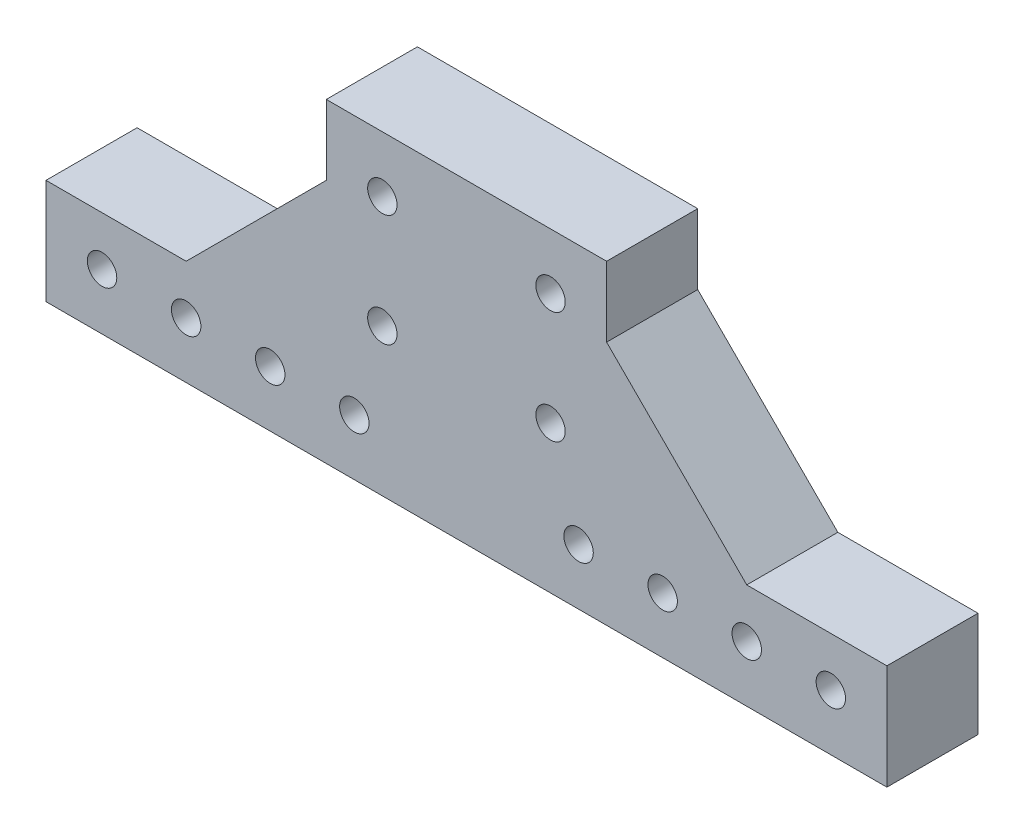
ISO-10303-21;
HEADER;
FILE_DESCRIPTION(('STEP AP214'),'2;1');
FILE_NAME('part.step','',(''),(''),'','','');
FILE_SCHEMA(('AUTOMOTIVE_DESIGN { 1 0 10303 214 1 1 1 1 }'));
ENDSEC;
DATA;
#1=APPLICATION_CONTEXT('core data for automotive mechanical design processes');
#2=APPLICATION_PROTOCOL_DEFINITION('international standard','automotive_design',2000,#1);
#3=PRODUCT_CONTEXT('',#1,'mechanical');
#4=PRODUCT('Part','Part','',(#3));
#5=PRODUCT_RELATED_PRODUCT_CATEGORY('part','',(#4));
#6=PRODUCT_DEFINITION_FORMATION('','',#4);
#7=PRODUCT_DEFINITION_CONTEXT('part definition',#1,'design');
#8=PRODUCT_DEFINITION('design','',#6,#7);
#9=PRODUCT_DEFINITION_SHAPE('','',#8);
#10=(LENGTH_UNIT() NAMED_UNIT(*) SI_UNIT(.MILLI.,.METRE.));
#11=(NAMED_UNIT(*) PLANE_ANGLE_UNIT() SI_UNIT($,.RADIAN.));
#12=(NAMED_UNIT(*) SI_UNIT($,.STERADIAN.) SOLID_ANGLE_UNIT());
#13=UNCERTAINTY_MEASURE_WITH_UNIT(LENGTH_MEASURE(1.E-05),#10,'distance_accuracy_value','');
#14=(GEOMETRIC_REPRESENTATION_CONTEXT(3) GLOBAL_UNCERTAINTY_ASSIGNED_CONTEXT((#13)) GLOBAL_UNIT_ASSIGNED_CONTEXT((#10,
#11,#12)) REPRESENTATION_CONTEXT('',''));
#15=CARTESIAN_POINT('',(0.,0.,0.));
#16=DIRECTION('',(0.,0.,1.));
#17=DIRECTION('',(1.,0.,0.));
#18=AXIS2_PLACEMENT_3D('',#15,#16,#17);
#19=CARTESIAN_POINT('',(0.,15.,13.));
#20=DIRECTION('',(1.,0.,0.));
#21=DIRECTION('',(0.,1.,0.));
#22=AXIS2_PLACEMENT_3D('',#19,#20,#21);
#23=PLANE('',#22);
#24=DIRECTION('',(0.,-1.,0.));
#25=VECTOR('',#24,1.);
#26=CARTESIAN_POINT('',(0.,15.,0.));
#27=LINE('',#26,#25);
#28=CARTESIAN_POINT('',(0.,15.,0.));
#29=VERTEX_POINT('',#28);
#30=CARTESIAN_POINT('',(0.,0.,0.));
#31=VERTEX_POINT('',#30);
#32=EDGE_CURVE('E143',#29,#31,#27,.T.);
#33=ORIENTED_EDGE('',*,*,#32,.T.);
#34=DIRECTION('',(0.,0.,-1.));
#35=VECTOR('',#34,1.);
#36=CARTESIAN_POINT('',(0.,0.,13.));
#37=LINE('',#36,#35);
#38=CARTESIAN_POINT('',(0.,0.,13.));
#39=VERTEX_POINT('',#38);
#40=EDGE_CURVE('E11',#39,#31,#37,.T.);
#41=ORIENTED_EDGE('',*,*,#40,.F.);
#42=DIRECTION('',(0.,-1.,0.));
#43=VECTOR('',#42,1.);
#44=CARTESIAN_POINT('',(0.,15.,13.));
#45=LINE('',#44,#43);
#46=CARTESIAN_POINT('',(0.,15.,13.));
#47=VERTEX_POINT('',#46);
#48=EDGE_CURVE('E162',#47,#39,#45,.T.);
#49=ORIENTED_EDGE('',*,*,#48,.F.);
#50=DIRECTION('',(0.,0.,-1.));
#51=VECTOR('',#50,1.);
#52=CARTESIAN_POINT('',(0.,15.,13.));
#53=LINE('',#52,#51);
#54=EDGE_CURVE('E139',#47,#29,#53,.T.);
#55=ORIENTED_EDGE('',*,*,#54,.T.);
#56=EDGE_LOOP('',(#33,#41,#49,#55));
#57=FACE_BOUND('',#56,.T.);
#58=ADVANCED_FACE('F35',(#57),#23,.F.);
#59=CARTESIAN_POINT('',(0.,0.,13.));
#60=DIRECTION('',(0.,1.,0.));
#61=DIRECTION('',(0.,0.,1.));
#62=AXIS2_PLACEMENT_3D('',#59,#60,#61);
#63=PLANE('',#62);
#64=DIRECTION('',(1.,0.,0.));
#65=VECTOR('',#64,1.);
#66=CARTESIAN_POINT('',(0.,0.,0.));
#67=LINE('',#66,#65);
#68=CARTESIAN_POINT('',(120.,0.,0.));
#69=VERTEX_POINT('',#68);
#70=EDGE_CURVE('E146',#31,#69,#67,.T.);
#71=ORIENTED_EDGE('',*,*,#70,.T.);
#72=DIRECTION('',(0.,0.,-1.));
#73=VECTOR('',#72,1.);
#74=CARTESIAN_POINT('',(120.,0.,13.));
#75=LINE('',#74,#73);
#76=CARTESIAN_POINT('',(120.,0.,13.));
#77=VERTEX_POINT('',#76);
#78=EDGE_CURVE('E43',#77,#69,#75,.T.);
#79=ORIENTED_EDGE('',*,*,#78,.F.);
#80=DIRECTION('',(1.,0.,0.));
#81=VECTOR('',#80,1.);
#82=CARTESIAN_POINT('',(0.,0.,13.));
#83=LINE('',#82,#81);
#84=EDGE_CURVE('E100',#39,#77,#83,.T.);
#85=ORIENTED_EDGE('',*,*,#84,.F.);
#86=ORIENTED_EDGE('',*,*,#40,.T.);
#87=EDGE_LOOP('',(#71,#79,#85,#86));
#88=FACE_BOUND('',#87,.T.);
#89=ADVANCED_FACE('F331',(#88),#63,.F.);
#90=CARTESIAN_POINT('',(120.,0.,13.));
#91=DIRECTION('',(-1.,0.,0.));
#92=DIRECTION('',(0.,0.,1.));
#93=AXIS2_PLACEMENT_3D('',#90,#91,#92);
#94=PLANE('',#93);
#95=DIRECTION('',(0.,1.,0.));
#96=VECTOR('',#95,1.);
#97=CARTESIAN_POINT('',(120.,0.,0.));
#98=LINE('',#97,#96);
#99=CARTESIAN_POINT('',(120.,15.,0.));
#100=VERTEX_POINT('',#99);
#101=EDGE_CURVE('E149',#69,#100,#98,.T.);
#102=ORIENTED_EDGE('',*,*,#101,.T.);
#103=DIRECTION('',(0.,0.,-1.));
#104=VECTOR('',#103,1.);
#105=CARTESIAN_POINT('',(120.,15.,13.));
#106=LINE('',#105,#104);
#107=CARTESIAN_POINT('',(120.,15.,13.));
#108=VERTEX_POINT('',#107);
#109=EDGE_CURVE('E175',#108,#100,#106,.T.);
#110=ORIENTED_EDGE('',*,*,#109,.F.);
#111=DIRECTION('',(0.,1.,0.));
#112=VECTOR('',#111,1.);
#113=CARTESIAN_POINT('',(120.,0.,13.));
#114=LINE('',#113,#112);
#115=EDGE_CURVE('E183',#77,#108,#114,.T.);
#116=ORIENTED_EDGE('',*,*,#115,.F.);
#117=ORIENTED_EDGE('',*,*,#78,.T.);
#118=EDGE_LOOP('',(#102,#110,#116,#117));
#119=FACE_BOUND('',#118,.T.);
#120=ADVANCED_FACE('F181',(#119),#94,.F.);
#121=CARTESIAN_POINT('',(120.,15.,13.));
#122=DIRECTION('',(0.,-1.,0.));
#123=DIRECTION('',(1.,0.,0.));
#124=AXIS2_PLACEMENT_3D('',#121,#122,#123);
#125=PLANE('',#124);
#126=DIRECTION('',(-1.,0.,0.));
#127=VECTOR('',#126,1.);
#128=CARTESIAN_POINT('',(120.,15.,0.));
#129=LINE('',#128,#127);
#130=CARTESIAN_POINT('',(100.,15.,0.));
#131=VERTEX_POINT('',#130);
#132=EDGE_CURVE('E151',#100,#131,#129,.T.);
#133=ORIENTED_EDGE('',*,*,#132,.T.);
#134=DIRECTION('',(0.,0.,-1.));
#135=VECTOR('',#134,1.);
#136=CARTESIAN_POINT('',(100.,15.,13.));
#137=LINE('',#136,#135);
#138=CARTESIAN_POINT('',(100.,15.,13.));
#139=VERTEX_POINT('',#138);
#140=EDGE_CURVE('E172',#139,#131,#137,.T.);
#141=ORIENTED_EDGE('',*,*,#140,.F.);
#142=DIRECTION('',(-1.,0.,0.));
#143=VECTOR('',#142,1.);
#144=CARTESIAN_POINT('',(120.,15.,13.));
#145=LINE('',#144,#143);
#146=EDGE_CURVE('E201',#108,#139,#145,.T.);
#147=ORIENTED_EDGE('',*,*,#146,.F.);
#148=ORIENTED_EDGE('',*,*,#109,.T.);
#149=EDGE_LOOP('',(#133,#141,#147,#148));
#150=FACE_BOUND('',#149,.T.);
#151=ADVANCED_FACE('F192',(#150),#125,.F.);
#152=CARTESIAN_POINT('',(100.,15.,13.));
#153=DIRECTION('',(-0.707106781186549,-0.707106781186546,0.));
#154=DIRECTION('',(0.707106781186546,-0.707106781186549,0.));
#155=AXIS2_PLACEMENT_3D('',#152,#153,#154);
#156=PLANE('',#155);
#157=DIRECTION('',(-0.707106781186546,0.707106781186549,0.));
#158=VECTOR('',#157,1.);
#159=CARTESIAN_POINT('',(100.,15.,0.));
#160=LINE('',#159,#158);
#161=CARTESIAN_POINT('',(80.0000000000001,35.0000000000001,0.));
#162=VERTEX_POINT('',#161);
#163=EDGE_CURVE('E153',#131,#162,#160,.T.);
#164=ORIENTED_EDGE('',*,*,#163,.T.);
#165=DIRECTION('',(0.,0.,-1.));
#166=VECTOR('',#165,1.);
#167=CARTESIAN_POINT('',(80.0000000000001,35.0000000000001,13.));
#168=LINE('',#167,#166);
#169=CARTESIAN_POINT('',(80.0000000000001,35.0000000000001,13.));
#170=VERTEX_POINT('',#169);
#171=EDGE_CURVE('E169',#170,#162,#168,.T.);
#172=ORIENTED_EDGE('',*,*,#171,.F.);
#173=DIRECTION('',(-0.707106781186546,0.707106781186549,0.));
#174=VECTOR('',#173,1.);
#175=CARTESIAN_POINT('',(100.,15.,13.));
#176=LINE('',#175,#174);
#177=EDGE_CURVE('E198',#139,#170,#176,.T.);
#178=ORIENTED_EDGE('',*,*,#177,.F.);
#179=ORIENTED_EDGE('',*,*,#140,.T.);
#180=EDGE_LOOP('',(#164,#172,#178,#179));
#181=FACE_BOUND('',#180,.T.);
#182=ADVANCED_FACE('F196',(#181),#156,.F.);
#183=CARTESIAN_POINT('',(80.0000000000001,35.0000000000001,13.));
#184=DIRECTION('',(-1.,0.,0.));
#185=DIRECTION('',(0.,-1.,0.));
#186=AXIS2_PLACEMENT_3D('',#183,#184,#185);
#187=PLANE('',#186);
#188=DIRECTION('',(0.,1.,0.));
#189=VECTOR('',#188,1.);
#190=CARTESIAN_POINT('',(80.0000000000001,35.0000000000001,0.));
#191=LINE('',#190,#189);
#192=CARTESIAN_POINT('',(80.0000000000001,45.,0.));
#193=VERTEX_POINT('',#192);
#194=EDGE_CURVE('E155',#162,#193,#191,.T.);
#195=ORIENTED_EDGE('',*,*,#194,.T.);
#196=DIRECTION('',(0.,0.,-1.));
#197=VECTOR('',#196,1.);
#198=CARTESIAN_POINT('',(80.0000000000001,45.,13.));
#199=LINE('',#198,#197);
#200=CARTESIAN_POINT('',(80.0000000000001,45.,13.));
#201=VERTEX_POINT('',#200);
#202=EDGE_CURVE('E166',#201,#193,#199,.T.);
#203=ORIENTED_EDGE('',*,*,#202,.F.);
#204=DIRECTION('',(0.,1.,0.));
#205=VECTOR('',#204,1.);
#206=CARTESIAN_POINT('',(80.0000000000001,35.0000000000001,13.));
#207=LINE('',#206,#205);
#208=EDGE_CURVE('E200',#170,#201,#207,.T.);
#209=ORIENTED_EDGE('',*,*,#208,.F.);
#210=ORIENTED_EDGE('',*,*,#171,.T.);
#211=EDGE_LOOP('',(#195,#203,#209,#210));
#212=FACE_BOUND('',#211,.T.);
#213=ADVANCED_FACE('F343',(#212),#187,.F.);
#214=CARTESIAN_POINT('',(80.0000000000001,45.,13.));
#215=DIRECTION('',(0.,-1.,0.));
#216=DIRECTION('',(1.,0.,0.));
#217=AXIS2_PLACEMENT_3D('',#214,#215,#216);
#218=PLANE('',#217);
#219=DIRECTION('',(-1.,0.,0.));
#220=VECTOR('',#219,1.);
#221=CARTESIAN_POINT('',(80.0000000000001,45.,0.));
#222=LINE('',#221,#220);
#223=CARTESIAN_POINT('',(40.0000000000001,45.,0.));
#224=VERTEX_POINT('',#223);
#225=EDGE_CURVE('E157',#193,#224,#222,.T.);
#226=ORIENTED_EDGE('',*,*,#225,.T.);
#227=DIRECTION('',(0.,0.,-1.));
#228=VECTOR('',#227,1.);
#229=CARTESIAN_POINT('',(40.0000000000001,45.,13.));
#230=LINE('',#229,#228);
#231=CARTESIAN_POINT('',(40.0000000000001,45.,13.));
#232=VERTEX_POINT('',#231);
#233=EDGE_CURVE('E134',#232,#224,#230,.T.);
#234=ORIENTED_EDGE('',*,*,#233,.F.);
#235=DIRECTION('',(-1.,0.,0.));
#236=VECTOR('',#235,1.);
#237=CARTESIAN_POINT('',(80.0000000000001,45.,13.));
#238=LINE('',#237,#236);
#239=EDGE_CURVE('E125',#201,#232,#238,.T.);
#240=ORIENTED_EDGE('',*,*,#239,.F.);
#241=ORIENTED_EDGE('',*,*,#202,.T.);
#242=EDGE_LOOP('',(#226,#234,#240,#241));
#243=FACE_BOUND('',#242,.T.);
#244=ADVANCED_FACE('F340',(#243),#218,.F.);
#245=CARTESIAN_POINT('',(40.0000000000001,45.,13.));
#246=DIRECTION('',(1.,0.,0.));
#247=DIRECTION('',(0.,1.,0.));
#248=AXIS2_PLACEMENT_3D('',#245,#246,#247);
#249=PLANE('',#248);
#250=DIRECTION('',(0.,-1.,0.));
#251=VECTOR('',#250,1.);
#252=CARTESIAN_POINT('',(40.0000000000001,45.,0.));
#253=LINE('',#252,#251);
#254=CARTESIAN_POINT('',(40.,35.0000000000001,0.));
#255=VERTEX_POINT('',#254);
#256=EDGE_CURVE('E133',#224,#255,#253,.T.);
#257=ORIENTED_EDGE('',*,*,#256,.T.);
#258=DIRECTION('',(0.,0.,-1.));
#259=VECTOR('',#258,1.);
#260=CARTESIAN_POINT('',(40.,35.0000000000001,13.));
#261=LINE('',#260,#259);
#262=CARTESIAN_POINT('',(40.,35.0000000000001,13.));
#263=VERTEX_POINT('',#262);
#264=EDGE_CURVE('E130',#263,#255,#261,.T.);
#265=ORIENTED_EDGE('',*,*,#264,.F.);
#266=DIRECTION('',(0.,-1.,0.));
#267=VECTOR('',#266,1.);
#268=CARTESIAN_POINT('',(40.0000000000001,45.,13.));
#269=LINE('',#268,#267);
#270=EDGE_CURVE('E119',#232,#263,#269,.T.);
#271=ORIENTED_EDGE('',*,*,#270,.F.);
#272=ORIENTED_EDGE('',*,*,#233,.T.);
#273=EDGE_LOOP('',(#257,#265,#271,#272));
#274=FACE_BOUND('',#273,.T.);
#275=ADVANCED_FACE('F131',(#274),#249,.F.);
#276=CARTESIAN_POINT('',(40.,35.0000000000001,13.));
#277=DIRECTION('',(0.70710678118655,-0.707106781186545,0.));
#278=DIRECTION('',(0.707106781186545,0.70710678118655,0.));
#279=AXIS2_PLACEMENT_3D('',#276,#277,#278);
#280=PLANE('',#279);
#281=DIRECTION('',(-0.707106781186545,-0.70710678118655,0.));
#282=VECTOR('',#281,1.);
#283=CARTESIAN_POINT('',(40.,35.0000000000001,0.));
#284=LINE('',#283,#282);
#285=CARTESIAN_POINT('',(20.,15.,0.));
#286=VERTEX_POINT('',#285);
#287=EDGE_CURVE('E86',#255,#286,#284,.T.);
#288=ORIENTED_EDGE('',*,*,#287,.T.);
#289=DIRECTION('',(0.,0.,-1.));
#290=VECTOR('',#289,1.);
#291=CARTESIAN_POINT('',(20.,15.,13.));
#292=LINE('',#291,#290);
#293=CARTESIAN_POINT('',(20.,15.,13.));
#294=VERTEX_POINT('',#293);
#295=EDGE_CURVE('E135',#294,#286,#292,.T.);
#296=ORIENTED_EDGE('',*,*,#295,.F.);
#297=DIRECTION('',(-0.707106781186545,-0.70710678118655,0.));
#298=VECTOR('',#297,1.);
#299=CARTESIAN_POINT('',(40.,35.0000000000001,13.));
#300=LINE('',#299,#298);
#301=EDGE_CURVE('E123',#263,#294,#300,.T.);
#302=ORIENTED_EDGE('',*,*,#301,.F.);
#303=ORIENTED_EDGE('',*,*,#264,.T.);
#304=EDGE_LOOP('',(#288,#296,#302,#303));
#305=FACE_BOUND('',#304,.T.);
#306=ADVANCED_FACE('F137',(#305),#280,.F.);
#307=CARTESIAN_POINT('',(20.,15.,13.));
#308=DIRECTION('',(0.,-1.,0.));
#309=DIRECTION('',(1.,0.,0.));
#310=AXIS2_PLACEMENT_3D('',#307,#308,#309);
#311=PLANE('',#310);
#312=DIRECTION('',(-1.,0.,0.));
#313=VECTOR('',#312,1.);
#314=CARTESIAN_POINT('',(20.,15.,0.));
#315=LINE('',#314,#313);
#316=EDGE_CURVE('E92',#286,#29,#315,.T.);
#317=ORIENTED_EDGE('',*,*,#316,.T.);
#318=ORIENTED_EDGE('',*,*,#54,.F.);
#319=DIRECTION('',(-1.,0.,0.));
#320=VECTOR('',#319,1.);
#321=CARTESIAN_POINT('',(20.,15.,13.));
#322=LINE('',#321,#320);
#323=EDGE_CURVE('E51',#294,#47,#322,.T.);
#324=ORIENTED_EDGE('',*,*,#323,.F.);
#325=ORIENTED_EDGE('',*,*,#295,.T.);
#326=EDGE_LOOP('',(#317,#318,#324,#325));
#327=FACE_BOUND('',#326,.T.);
#328=ADVANCED_FACE('F292',(#327),#311,.F.);
#329=CARTESIAN_POINT('',(0.,0.,13.));
#330=DIRECTION('',(0.,0.,1.));
#331=DIRECTION('',(1.,0.,0.));
#332=AXIS2_PLACEMENT_3D('',#329,#330,#331);
#333=PLANE('',#332);
#334=CARTESIAN_POINT('',(32.,8.,13.));
#335=DIRECTION('',(0.,0.,1.));
#336=DIRECTION('',(1.,0.,0.));
#337=AXIS2_PLACEMENT_3D('',#334,#335,#336);
#338=CIRCLE('',#337,2.1);
#339=CARTESIAN_POINT('',(34.1,8.,13.));
#340=VERTEX_POINT('',#339);
#341=EDGE_CURVE('E275',#340,#340,#338,.T.);
#342=ORIENTED_EDGE('',*,*,#341,.F.);
#343=EDGE_LOOP('',(#342));
#344=FACE_BOUND('',#343,.T.);
#345=CARTESIAN_POINT('',(44.,8.,13.));
#346=DIRECTION('',(0.,0.,1.));
#347=DIRECTION('',(1.,0.,0.));
#348=AXIS2_PLACEMENT_3D('',#345,#346,#347);
#349=CIRCLE('',#348,2.1);
#350=CARTESIAN_POINT('',(46.1,8.,13.));
#351=VERTEX_POINT('',#350);
#352=EDGE_CURVE('E269',#351,#351,#349,.T.);
#353=ORIENTED_EDGE('',*,*,#352,.F.);
#354=EDGE_LOOP('',(#353));
#355=FACE_BOUND('',#354,.T.);
#356=CARTESIAN_POINT('',(76.0000000000001,8.,13.));
#357=DIRECTION('',(0.,0.,1.));
#358=DIRECTION('',(1.,0.,0.));
#359=AXIS2_PLACEMENT_3D('',#356,#357,#358);
#360=CIRCLE('',#359,2.1);
#361=CARTESIAN_POINT('',(78.1000000000001,8.,13.));
#362=VERTEX_POINT('',#361);
#363=EDGE_CURVE('E263',#362,#362,#360,.T.);
#364=ORIENTED_EDGE('',*,*,#363,.F.);
#365=EDGE_LOOP('',(#364));
#366=FACE_BOUND('',#365,.T.);
#367=CARTESIAN_POINT('',(88.0000000000001,8.,13.));
#368=DIRECTION('',(0.,0.,1.));
#369=DIRECTION('',(1.,0.,0.));
#370=AXIS2_PLACEMENT_3D('',#367,#368,#369);
#371=CIRCLE('',#370,2.1);
#372=CARTESIAN_POINT('',(90.1000000000001,8.,13.));
#373=VERTEX_POINT('',#372);
#374=EDGE_CURVE('E257',#373,#373,#371,.T.);
#375=ORIENTED_EDGE('',*,*,#374,.F.);
#376=EDGE_LOOP('',(#375));
#377=FACE_BOUND('',#376,.T.);
#378=CARTESIAN_POINT('',(8.,8.,13.));
#379=DIRECTION('',(0.,0.,1.));
#380=DIRECTION('',(1.,0.,0.));
#381=AXIS2_PLACEMENT_3D('',#378,#379,#380);
#382=CIRCLE('',#381,2.1);
#383=CARTESIAN_POINT('',(10.1,8.,13.));
#384=VERTEX_POINT('',#383);
#385=EDGE_CURVE('E227',#384,#384,#382,.T.);
#386=ORIENTED_EDGE('',*,*,#385,.F.);
#387=EDGE_LOOP('',(#386));
#388=FACE_BOUND('',#387,.T.);
#389=CARTESIAN_POINT('',(72.0000000000001,21.,13.));
#390=DIRECTION('',(0.,0.,1.));
#391=DIRECTION('',(1.,0.,0.));
#392=AXIS2_PLACEMENT_3D('',#389,#390,#391);
#393=CIRCLE('',#392,2.09999999999999);
#394=CARTESIAN_POINT('',(74.1000000000001,21.,13.));
#395=VERTEX_POINT('',#394);
#396=EDGE_CURVE('E234',#395,#395,#393,.T.);
#397=ORIENTED_EDGE('',*,*,#396,.F.);
#398=EDGE_LOOP('',(#397));
#399=FACE_BOUND('',#398,.T.);
#400=CARTESIAN_POINT('',(48.0000000000001,21.,13.));
#401=DIRECTION('',(0.,0.,1.));
#402=DIRECTION('',(1.,0.,0.));
#403=AXIS2_PLACEMENT_3D('',#400,#401,#402);
#404=CIRCLE('',#403,2.1);
#405=CARTESIAN_POINT('',(50.1000000000001,21.,13.));
#406=VERTEX_POINT('',#405);
#407=EDGE_CURVE('E215',#406,#406,#404,.T.);
#408=ORIENTED_EDGE('',*,*,#407,.F.);
#409=EDGE_LOOP('',(#408));
#410=FACE_BOUND('',#409,.T.);
#411=CARTESIAN_POINT('',(72.0000000000001,37.,13.));
#412=DIRECTION('',(0.,0.,1.));
#413=DIRECTION('',(1.,0.,0.));
#414=AXIS2_PLACEMENT_3D('',#411,#412,#413);
#415=CIRCLE('',#414,2.09999999999999);
#416=CARTESIAN_POINT('',(74.1000000000001,37.,13.));
#417=VERTEX_POINT('',#416);
#418=EDGE_CURVE('E222',#417,#417,#415,.T.);
#419=ORIENTED_EDGE('',*,*,#418,.F.);
#420=EDGE_LOOP('',(#419));
#421=FACE_BOUND('',#420,.T.);
#422=CARTESIAN_POINT('',(20.,8.,13.));
#423=DIRECTION('',(0.,0.,1.));
#424=DIRECTION('',(1.,0.,0.));
#425=AXIS2_PLACEMENT_3D('',#422,#423,#424);
#426=CIRCLE('',#425,2.1);
#427=CARTESIAN_POINT('',(22.1,8.,13.));
#428=VERTEX_POINT('',#427);
#429=EDGE_CURVE('E252',#428,#428,#426,.T.);
#430=ORIENTED_EDGE('',*,*,#429,.F.);
#431=EDGE_LOOP('',(#430));
#432=FACE_BOUND('',#431,.T.);
#433=CARTESIAN_POINT('',(100.,8.,13.));
#434=DIRECTION('',(0.,0.,1.));
#435=DIRECTION('',(1.,0.,0.));
#436=AXIS2_PLACEMENT_3D('',#433,#434,#435);
#437=CIRCLE('',#436,2.1);
#438=CARTESIAN_POINT('',(102.1,8.,13.));
#439=VERTEX_POINT('',#438);
#440=EDGE_CURVE('E246',#439,#439,#437,.T.);
#441=ORIENTED_EDGE('',*,*,#440,.F.);
#442=EDGE_LOOP('',(#441));
#443=FACE_BOUND('',#442,.T.);
#444=CARTESIAN_POINT('',(112.,8.,13.));
#445=DIRECTION('',(0.,0.,1.));
#446=DIRECTION('',(1.,0.,0.));
#447=AXIS2_PLACEMENT_3D('',#444,#445,#446);
#448=CIRCLE('',#447,2.1);
#449=CARTESIAN_POINT('',(114.1,8.,13.));
#450=VERTEX_POINT('',#449);
#451=EDGE_CURVE('E239',#450,#450,#448,.T.);
#452=ORIENTED_EDGE('',*,*,#451,.F.);
#453=EDGE_LOOP('',(#452));
#454=FACE_BOUND('',#453,.T.);
#455=CARTESIAN_POINT('',(48.0000000000001,37.,13.));
#456=DIRECTION('',(0.,0.,1.));
#457=DIRECTION('',(1.,0.,0.));
#458=AXIS2_PLACEMENT_3D('',#455,#456,#457);
#459=CIRCLE('',#458,2.1);
#460=CARTESIAN_POINT('',(50.1000000000001,37.,13.));
#461=VERTEX_POINT('',#460);
#462=EDGE_CURVE('E209',#461,#461,#459,.T.);
#463=ORIENTED_EDGE('',*,*,#462,.F.);
#464=EDGE_LOOP('',(#463));
#465=FACE_BOUND('',#464,.T.);
#466=ORIENTED_EDGE('',*,*,#48,.T.);
#467=ORIENTED_EDGE('',*,*,#84,.T.);
#468=ORIENTED_EDGE('',*,*,#115,.T.);
#469=ORIENTED_EDGE('',*,*,#146,.T.);
#470=ORIENTED_EDGE('',*,*,#177,.T.);
#471=ORIENTED_EDGE('',*,*,#208,.T.);
#472=ORIENTED_EDGE('',*,*,#239,.T.);
#473=ORIENTED_EDGE('',*,*,#270,.T.);
#474=ORIENTED_EDGE('',*,*,#301,.T.);
#475=ORIENTED_EDGE('',*,*,#323,.T.);
#476=EDGE_LOOP('',(#466,#467,#468,#469,#470,#471,#472,#473,#474,#475));
#477=FACE_BOUND('',#476,.T.);
#478=ADVANCED_FACE('F121',(#344,#355,#366,#377,#388,#399,#410,#421,#432,#443,#454,#465,#477),
#333,.T.);
#479=CARTESIAN_POINT('',(0.,0.,0.));
#480=DIRECTION('',(0.,0.,1.));
#481=DIRECTION('',(1.,0.,0.));
#482=AXIS2_PLACEMENT_3D('',#479,#480,#481);
#483=PLANE('',#482);
#484=CARTESIAN_POINT('',(32.,8.,0.));
#485=DIRECTION('',(0.,0.,1.));
#486=DIRECTION('',(1.,0.,0.));
#487=AXIS2_PLACEMENT_3D('',#484,#485,#486);
#488=CIRCLE('',#487,2.1);
#489=CARTESIAN_POINT('',(34.1,8.,0.));
#490=VERTEX_POINT('',#489);
#491=EDGE_CURVE('E243',#490,#490,#488,.T.);
#492=ORIENTED_EDGE('',*,*,#491,.T.);
#493=EDGE_LOOP('',(#492));
#494=FACE_BOUND('',#493,.T.);
#495=CARTESIAN_POINT('',(44.,8.,0.));
#496=DIRECTION('',(0.,0.,1.));
#497=DIRECTION('',(1.,0.,0.));
#498=AXIS2_PLACEMENT_3D('',#495,#496,#497);
#499=CIRCLE('',#498,2.1);
#500=CARTESIAN_POINT('',(46.1,8.,0.));
#501=VERTEX_POINT('',#500);
#502=EDGE_CURVE('E272',#501,#501,#499,.T.);
#503=ORIENTED_EDGE('',*,*,#502,.T.);
#504=EDGE_LOOP('',(#503));
#505=FACE_BOUND('',#504,.T.);
#506=CARTESIAN_POINT('',(76.0000000000001,8.,0.));
#507=DIRECTION('',(0.,0.,1.));
#508=DIRECTION('',(1.,0.,0.));
#509=AXIS2_PLACEMENT_3D('',#506,#507,#508);
#510=CIRCLE('',#509,2.1);
#511=CARTESIAN_POINT('',(78.1000000000001,8.,0.));
#512=VERTEX_POINT('',#511);
#513=EDGE_CURVE('E266',#512,#512,#510,.T.);
#514=ORIENTED_EDGE('',*,*,#513,.T.);
#515=EDGE_LOOP('',(#514));
#516=FACE_BOUND('',#515,.T.);
#517=CARTESIAN_POINT('',(88.0000000000001,8.,0.));
#518=DIRECTION('',(0.,0.,1.));
#519=DIRECTION('',(1.,0.,0.));
#520=AXIS2_PLACEMENT_3D('',#517,#518,#519);
#521=CIRCLE('',#520,2.1);
#522=CARTESIAN_POINT('',(90.1000000000001,8.,0.));
#523=VERTEX_POINT('',#522);
#524=EDGE_CURVE('E260',#523,#523,#521,.T.);
#525=ORIENTED_EDGE('',*,*,#524,.T.);
#526=EDGE_LOOP('',(#525));
#527=FACE_BOUND('',#526,.T.);
#528=ORIENTED_EDGE('',*,*,#32,.F.);
#529=ORIENTED_EDGE('',*,*,#316,.F.);
#530=ORIENTED_EDGE('',*,*,#287,.F.);
#531=ORIENTED_EDGE('',*,*,#256,.F.);
#532=ORIENTED_EDGE('',*,*,#225,.F.);
#533=ORIENTED_EDGE('',*,*,#194,.F.);
#534=ORIENTED_EDGE('',*,*,#163,.F.);
#535=ORIENTED_EDGE('',*,*,#132,.F.);
#536=ORIENTED_EDGE('',*,*,#101,.F.);
#537=ORIENTED_EDGE('',*,*,#70,.F.);
#538=EDGE_LOOP('',(#528,#529,#530,#531,#532,#533,#534,#535,#536,#537));
#539=FACE_BOUND('',#538,.T.);
#540=ADVANCED_FACE('F187',(#494,#505,#516,#527,#539),#483,.F.);
#541=CARTESIAN_POINT('',(48.0000000000001,37.,10.));
#542=DIRECTION('',(0.,0.,1.));
#543=DIRECTION('',(1.,0.,0.));
#544=AXIS2_PLACEMENT_3D('',#541,#542,#543);
#545=CYLINDRICAL_SURFACE('',#544,2.1);
#546=CARTESIAN_POINT('',(48.0000000000001,37.,10.));
#547=DIRECTION('',(0.,0.,1.));
#548=DIRECTION('',(1.,0.,0.));
#549=AXIS2_PLACEMENT_3D('',#546,#547,#548);
#550=CIRCLE('',#549,2.1);
#551=CARTESIAN_POINT('',(50.1000000000001,37.,10.));
#552=VERTEX_POINT('',#551);
#553=EDGE_CURVE('E147',#552,#552,#550,.T.);
#554=ORIENTED_EDGE('',*,*,#553,.F.);
#555=EDGE_LOOP('',(#554));
#556=FACE_BOUND('',#555,.T.);
#557=ORIENTED_EDGE('',*,*,#462,.T.);
#558=EDGE_LOOP('',(#557));
#559=FACE_BOUND('',#558,.T.);
#560=ADVANCED_FACE('F316',(#556,#559),#545,.F.);
#561=CARTESIAN_POINT('',(48.0000000000001,37.,10.));
#562=DIRECTION('',(0.,0.,1.));
#563=DIRECTION('',(1.,0.,0.));
#564=AXIS2_PLACEMENT_3D('',#561,#562,#563);
#565=PLANE('',#564);
#566=ORIENTED_EDGE('',*,*,#553,.T.);
#567=EDGE_LOOP('',(#566));
#568=FACE_BOUND('',#567,.T.);
#569=ADVANCED_FACE('F318',(#568),#565,.T.);
#570=CARTESIAN_POINT('',(112.,8.,10.));
#571=DIRECTION('',(0.,0.,1.));
#572=DIRECTION('',(1.,0.,0.));
#573=AXIS2_PLACEMENT_3D('',#570,#571,#572);
#574=CYLINDRICAL_SURFACE('',#573,2.1);
#575=CARTESIAN_POINT('',(112.,8.,10.));
#576=DIRECTION('',(0.,0.,1.));
#577=DIRECTION('',(1.,0.,0.));
#578=AXIS2_PLACEMENT_3D('',#575,#576,#577);
#579=CIRCLE('',#578,2.1);
#580=CARTESIAN_POINT('',(114.1,8.,10.));
#581=VERTEX_POINT('',#580);
#582=EDGE_CURVE('E242',#581,#581,#579,.T.);
#583=ORIENTED_EDGE('',*,*,#582,.F.);
#584=EDGE_LOOP('',(#583));
#585=FACE_BOUND('',#584,.T.);
#586=ORIENTED_EDGE('',*,*,#451,.T.);
#587=EDGE_LOOP('',(#586));
#588=FACE_BOUND('',#587,.T.);
#589=ADVANCED_FACE('F325',(#585,#588),#574,.F.);
#590=CARTESIAN_POINT('',(112.,8.,10.));
#591=DIRECTION('',(0.,0.,1.));
#592=DIRECTION('',(1.,0.,0.));
#593=AXIS2_PLACEMENT_3D('',#590,#591,#592);
#594=PLANE('',#593);
#595=ORIENTED_EDGE('',*,*,#582,.T.);
#596=EDGE_LOOP('',(#595));
#597=FACE_BOUND('',#596,.T.);
#598=ADVANCED_FACE('F423',(#597),#594,.T.);
#599=CARTESIAN_POINT('',(100.,8.,10.));
#600=DIRECTION('',(0.,0.,1.));
#601=DIRECTION('',(1.,0.,0.));
#602=AXIS2_PLACEMENT_3D('',#599,#600,#601);
#603=CYLINDRICAL_SURFACE('',#602,2.1);
#604=CARTESIAN_POINT('',(100.,8.,10.));
#605=DIRECTION('',(0.,0.,1.));
#606=DIRECTION('',(1.,0.,0.));
#607=AXIS2_PLACEMENT_3D('',#604,#605,#606);
#608=CIRCLE('',#607,2.1);
#609=CARTESIAN_POINT('',(102.1,8.,10.));
#610=VERTEX_POINT('',#609);
#611=EDGE_CURVE('E249',#610,#610,#608,.T.);
#612=ORIENTED_EDGE('',*,*,#611,.F.);
#613=EDGE_LOOP('',(#612));
#614=FACE_BOUND('',#613,.T.);
#615=ORIENTED_EDGE('',*,*,#440,.T.);
#616=EDGE_LOOP('',(#615));
#617=FACE_BOUND('',#616,.T.);
#618=ADVANCED_FACE('F433',(#614,#617),#603,.F.);
#619=CARTESIAN_POINT('',(100.,8.,10.));
#620=DIRECTION('',(0.,0.,1.));
#621=DIRECTION('',(1.,0.,0.));
#622=AXIS2_PLACEMENT_3D('',#619,#620,#621);
#623=PLANE('',#622);
#624=ORIENTED_EDGE('',*,*,#611,.T.);
#625=EDGE_LOOP('',(#624));
#626=FACE_BOUND('',#625,.T.);
#627=ADVANCED_FACE('F443',(#626),#623,.T.);
#628=CARTESIAN_POINT('',(20.,8.,10.));
#629=DIRECTION('',(0.,0.,1.));
#630=DIRECTION('',(1.,0.,0.));
#631=AXIS2_PLACEMENT_3D('',#628,#629,#630);
#632=CYLINDRICAL_SURFACE('',#631,2.1);
#633=CARTESIAN_POINT('',(20.,8.,10.));
#634=DIRECTION('',(0.,0.,1.));
#635=DIRECTION('',(1.,0.,0.));
#636=AXIS2_PLACEMENT_3D('',#633,#634,#635);
#637=CIRCLE('',#636,2.1);
#638=CARTESIAN_POINT('',(22.1,8.,10.));
#639=VERTEX_POINT('',#638);
#640=EDGE_CURVE('E231',#639,#639,#637,.T.);
#641=ORIENTED_EDGE('',*,*,#640,.F.);
#642=EDGE_LOOP('',(#641));
#643=FACE_BOUND('',#642,.T.);
#644=ORIENTED_EDGE('',*,*,#429,.T.);
#645=EDGE_LOOP('',(#644));
#646=FACE_BOUND('',#645,.T.);
#647=ADVANCED_FACE('F453',(#643,#646),#632,.F.);
#648=CARTESIAN_POINT('',(20.,8.,10.));
#649=DIRECTION('',(0.,0.,1.));
#650=DIRECTION('',(1.,0.,0.));
#651=AXIS2_PLACEMENT_3D('',#648,#649,#650);
#652=PLANE('',#651);
#653=ORIENTED_EDGE('',*,*,#640,.T.);
#654=EDGE_LOOP('',(#653));
#655=FACE_BOUND('',#654,.T.);
#656=ADVANCED_FACE('F463',(#655),#652,.T.);
#657=CARTESIAN_POINT('',(72.0000000000001,37.,10.));
#658=DIRECTION('',(0.,0.,1.));
#659=DIRECTION('',(1.,0.,0.));
#660=AXIS2_PLACEMENT_3D('',#657,#658,#659);
#661=CYLINDRICAL_SURFACE('',#660,2.09999999999999);
#662=CARTESIAN_POINT('',(72.0000000000001,37.,10.));
#663=DIRECTION('',(0.,0.,1.));
#664=DIRECTION('',(1.,0.,0.));
#665=AXIS2_PLACEMENT_3D('',#662,#663,#664);
#666=CIRCLE('',#665,2.09999999999999);
#667=CARTESIAN_POINT('',(74.1000000000001,37.,10.));
#668=VERTEX_POINT('',#667);
#669=EDGE_CURVE('E212',#668,#668,#666,.T.);
#670=ORIENTED_EDGE('',*,*,#669,.F.);
#671=EDGE_LOOP('',(#670));
#672=FACE_BOUND('',#671,.T.);
#673=ORIENTED_EDGE('',*,*,#418,.T.);
#674=EDGE_LOOP('',(#673));
#675=FACE_BOUND('',#674,.T.);
#676=ADVANCED_FACE('F473',(#672,#675),#661,.F.);
#677=CARTESIAN_POINT('',(72.0000000000001,37.,10.));
#678=DIRECTION('',(0.,0.,1.));
#679=DIRECTION('',(1.,0.,0.));
#680=AXIS2_PLACEMENT_3D('',#677,#678,#679);
#681=PLANE('',#680);
#682=ORIENTED_EDGE('',*,*,#669,.T.);
#683=EDGE_LOOP('',(#682));
#684=FACE_BOUND('',#683,.T.);
#685=ADVANCED_FACE('F483',(#684),#681,.T.);
#686=CARTESIAN_POINT('',(48.0000000000001,21.,10.));
#687=DIRECTION('',(0.,0.,1.));
#688=DIRECTION('',(1.,0.,0.));
#689=AXIS2_PLACEMENT_3D('',#686,#687,#688);
#690=CYLINDRICAL_SURFACE('',#689,2.1);
#691=CARTESIAN_POINT('',(48.0000000000001,21.,10.));
#692=DIRECTION('',(0.,0.,1.));
#693=DIRECTION('',(1.,0.,0.));
#694=AXIS2_PLACEMENT_3D('',#691,#692,#693);
#695=CIRCLE('',#694,2.1);
#696=CARTESIAN_POINT('',(50.1000000000001,21.,10.));
#697=VERTEX_POINT('',#696);
#698=EDGE_CURVE('E218',#697,#697,#695,.T.);
#699=ORIENTED_EDGE('',*,*,#698,.F.);
#700=EDGE_LOOP('',(#699));
#701=FACE_BOUND('',#700,.T.);
#702=ORIENTED_EDGE('',*,*,#407,.T.);
#703=EDGE_LOOP('',(#702));
#704=FACE_BOUND('',#703,.T.);
#705=ADVANCED_FACE('F493',(#701,#704),#690,.F.);
#706=CARTESIAN_POINT('',(48.0000000000001,21.,10.));
#707=DIRECTION('',(0.,0.,1.));
#708=DIRECTION('',(1.,0.,0.));
#709=AXIS2_PLACEMENT_3D('',#706,#707,#708);
#710=PLANE('',#709);
#711=ORIENTED_EDGE('',*,*,#698,.T.);
#712=EDGE_LOOP('',(#711));
#713=FACE_BOUND('',#712,.T.);
#714=ADVANCED_FACE('F503',(#713),#710,.T.);
#715=CARTESIAN_POINT('',(72.0000000000001,21.,10.));
#716=DIRECTION('',(0.,0.,1.));
#717=DIRECTION('',(1.,0.,0.));
#718=AXIS2_PLACEMENT_3D('',#715,#716,#717);
#719=CYLINDRICAL_SURFACE('',#718,2.09999999999999);
#720=CARTESIAN_POINT('',(72.0000000000001,21.,10.));
#721=DIRECTION('',(0.,0.,1.));
#722=DIRECTION('',(1.,0.,0.));
#723=AXIS2_PLACEMENT_3D('',#720,#721,#722);
#724=CIRCLE('',#723,2.09999999999999);
#725=CARTESIAN_POINT('',(74.1000000000001,21.,10.));
#726=VERTEX_POINT('',#725);
#727=EDGE_CURVE('E219',#726,#726,#724,.T.);
#728=ORIENTED_EDGE('',*,*,#727,.F.);
#729=EDGE_LOOP('',(#728));
#730=FACE_BOUND('',#729,.T.);
#731=ORIENTED_EDGE('',*,*,#396,.T.);
#732=EDGE_LOOP('',(#731));
#733=FACE_BOUND('',#732,.T.);
#734=ADVANCED_FACE('F513',(#730,#733),#719,.F.);
#735=CARTESIAN_POINT('',(72.0000000000001,21.,10.));
#736=DIRECTION('',(0.,0.,1.));
#737=DIRECTION('',(1.,0.,0.));
#738=AXIS2_PLACEMENT_3D('',#735,#736,#737);
#739=PLANE('',#738);
#740=ORIENTED_EDGE('',*,*,#727,.T.);
#741=EDGE_LOOP('',(#740));
#742=FACE_BOUND('',#741,.T.);
#743=ADVANCED_FACE('F523',(#742),#739,.T.);
#744=CARTESIAN_POINT('',(8.,8.,10.));
#745=DIRECTION('',(0.,0.,1.));
#746=DIRECTION('',(1.,0.,0.));
#747=AXIS2_PLACEMENT_3D('',#744,#745,#746);
#748=CYLINDRICAL_SURFACE('',#747,2.1);
#749=CARTESIAN_POINT('',(8.,8.,10.));
#750=DIRECTION('',(0.,0.,1.));
#751=DIRECTION('',(1.,0.,0.));
#752=AXIS2_PLACEMENT_3D('',#749,#750,#751);
#753=CIRCLE('',#752,2.1);
#754=CARTESIAN_POINT('',(10.1,8.,10.));
#755=VERTEX_POINT('',#754);
#756=EDGE_CURVE('E230',#755,#755,#753,.T.);
#757=ORIENTED_EDGE('',*,*,#756,.F.);
#758=EDGE_LOOP('',(#757));
#759=FACE_BOUND('',#758,.T.);
#760=ORIENTED_EDGE('',*,*,#385,.T.);
#761=EDGE_LOOP('',(#760));
#762=FACE_BOUND('',#761,.T.);
#763=ADVANCED_FACE('F533',(#759,#762),#748,.F.);
#764=CARTESIAN_POINT('',(8.,8.,10.));
#765=DIRECTION('',(0.,0.,1.));
#766=DIRECTION('',(1.,0.,0.));
#767=AXIS2_PLACEMENT_3D('',#764,#765,#766);
#768=PLANE('',#767);
#769=ORIENTED_EDGE('',*,*,#756,.T.);
#770=EDGE_LOOP('',(#769));
#771=FACE_BOUND('',#770,.T.);
#772=ADVANCED_FACE('F543',(#771),#768,.T.);
#773=CARTESIAN_POINT('',(88.0000000000001,8.,0.));
#774=DIRECTION('',(0.,0.,1.));
#775=DIRECTION('',(1.,0.,0.));
#776=AXIS2_PLACEMENT_3D('',#773,#774,#775);
#777=CYLINDRICAL_SURFACE('',#776,2.1);
#778=ORIENTED_EDGE('',*,*,#524,.F.);
#779=EDGE_LOOP('',(#778));
#780=FACE_BOUND('',#779,.T.);
#781=ORIENTED_EDGE('',*,*,#374,.T.);
#782=EDGE_LOOP('',(#781));
#783=FACE_BOUND('',#782,.T.);
#784=ADVANCED_FACE('F553',(#780,#783),#777,.F.);
#785=CARTESIAN_POINT('',(76.0000000000001,8.,0.));
#786=DIRECTION('',(0.,0.,1.));
#787=DIRECTION('',(1.,0.,0.));
#788=AXIS2_PLACEMENT_3D('',#785,#786,#787);
#789=CYLINDRICAL_SURFACE('',#788,2.1);
#790=ORIENTED_EDGE('',*,*,#513,.F.);
#791=EDGE_LOOP('',(#790));
#792=FACE_BOUND('',#791,.T.);
#793=ORIENTED_EDGE('',*,*,#363,.T.);
#794=EDGE_LOOP('',(#793));
#795=FACE_BOUND('',#794,.T.);
#796=ADVANCED_FACE('F573',(#792,#795),#789,.F.);
#797=CARTESIAN_POINT('',(44.,8.,0.));
#798=DIRECTION('',(0.,0.,1.));
#799=DIRECTION('',(1.,0.,0.));
#800=AXIS2_PLACEMENT_3D('',#797,#798,#799);
#801=CYLINDRICAL_SURFACE('',#800,2.1);
#802=ORIENTED_EDGE('',*,*,#502,.F.);
#803=EDGE_LOOP('',(#802));
#804=FACE_BOUND('',#803,.T.);
#805=ORIENTED_EDGE('',*,*,#352,.T.);
#806=EDGE_LOOP('',(#805));
#807=FACE_BOUND('',#806,.T.);
#808=ADVANCED_FACE('F286',(#804,#807),#801,.F.);
#809=CARTESIAN_POINT('',(32.,8.,0.));
#810=DIRECTION('',(0.,0.,1.));
#811=DIRECTION('',(1.,0.,0.));
#812=AXIS2_PLACEMENT_3D('',#809,#810,#811);
#813=CYLINDRICAL_SURFACE('',#812,2.1);
#814=ORIENTED_EDGE('',*,*,#491,.F.);
#815=EDGE_LOOP('',(#814));
#816=FACE_BOUND('',#815,.T.);
#817=ORIENTED_EDGE('',*,*,#341,.T.);
#818=EDGE_LOOP('',(#817));
#819=FACE_BOUND('',#818,.T.);
#820=ADVANCED_FACE('F283',(#816,#819),#813,.F.);
#821=CLOSED_SHELL('',(#58,#89,#120,#151,#182,#213,#244,#275,#306,#328,#478,#540,#560,#569,#589,
#598,#618,#627,#647,#656,#676,#685,#705,#714,#734,#743,#763,#772,#784,#796,#808,#820));
#822=MANIFOLD_SOLID_BREP('B2',#821);
#823=ADVANCED_BREP_SHAPE_REPRESENTATION('',(#18,#822),#14);
#824=SHAPE_DEFINITION_REPRESENTATION(#9,#823);
ENDSEC;
END-ISO-10303-21;
